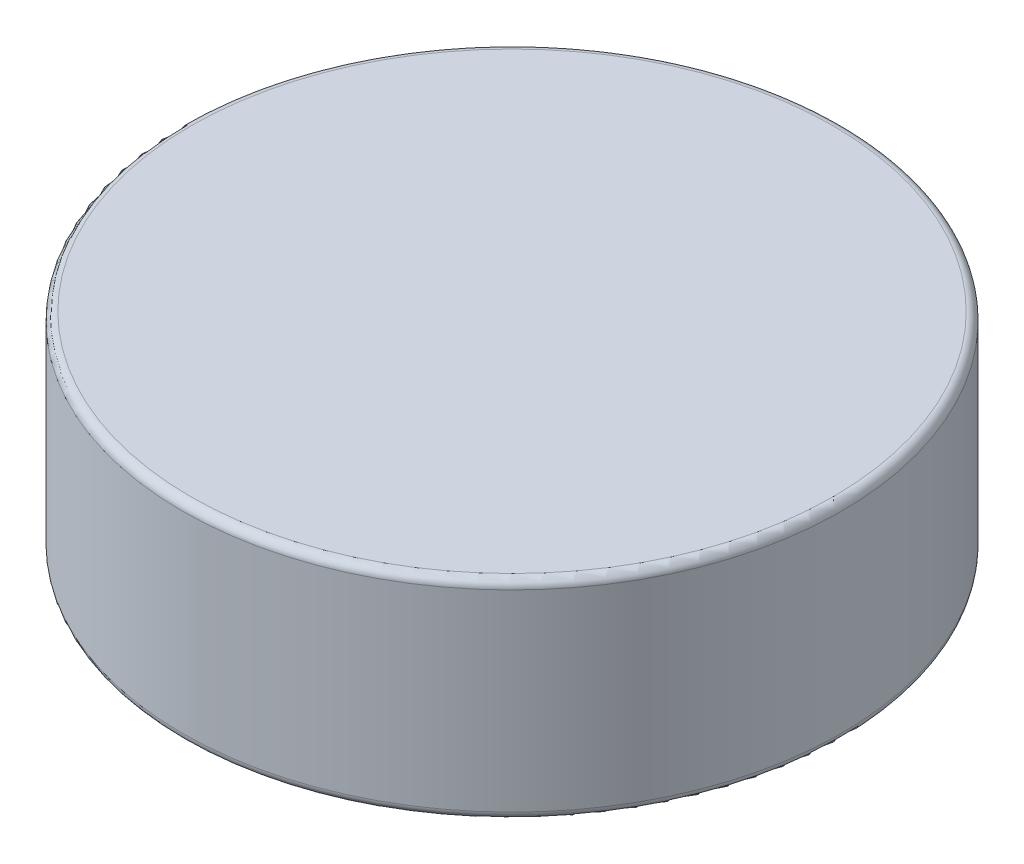
ISO-10303-21;
HEADER;
FILE_DESCRIPTION(('STEP AP214'),'2;1');
FILE_NAME('part.step','',(''),(''),'','','');
FILE_SCHEMA(('AUTOMOTIVE_DESIGN { 1 0 10303 214 1 1 1 1 }'));
ENDSEC;
DATA;
#1=APPLICATION_CONTEXT('core data for automotive mechanical design processes');
#2=APPLICATION_PROTOCOL_DEFINITION('international standard','automotive_design',2000,#1);
#3=PRODUCT_CONTEXT('',#1,'mechanical');
#4=PRODUCT('Part','Part','',(#3));
#5=PRODUCT_RELATED_PRODUCT_CATEGORY('part','',(#4));
#6=PRODUCT_DEFINITION_FORMATION('','',#4);
#7=PRODUCT_DEFINITION_CONTEXT('part definition',#1,'design');
#8=PRODUCT_DEFINITION('design','',#6,#7);
#9=PRODUCT_DEFINITION_SHAPE('','',#8);
#10=(LENGTH_UNIT() NAMED_UNIT(*) SI_UNIT(.MILLI.,.METRE.));
#11=(NAMED_UNIT(*) PLANE_ANGLE_UNIT() SI_UNIT($,.RADIAN.));
#12=(NAMED_UNIT(*) SI_UNIT($,.STERADIAN.) SOLID_ANGLE_UNIT());
#13=UNCERTAINTY_MEASURE_WITH_UNIT(LENGTH_MEASURE(1.E-05),#10,'distance_accuracy_value','');
#14=(GEOMETRIC_REPRESENTATION_CONTEXT(3) GLOBAL_UNCERTAINTY_ASSIGNED_CONTEXT((#13)) GLOBAL_UNIT_ASSIGNED_CONTEXT((#10,
#11,#12)) REPRESENTATION_CONTEXT('',''));
#15=CARTESIAN_POINT('',(0.,0.,0.));
#16=DIRECTION('',(0.,0.,1.));
#17=DIRECTION('',(1.,0.,0.));
#18=AXIS2_PLACEMENT_3D('',#15,#16,#17);
#19=CARTESIAN_POINT('',(0.,3.175,0.));
#20=DIRECTION('',(0.,-1.,0.));
#21=DIRECTION('',(0.,0.,-1.));
#22=AXIS2_PLACEMENT_3D('',#19,#20,#21);
#23=CYLINDRICAL_SURFACE('',#22,5.0038);
#24=CARTESIAN_POINT('',(0.,0.127,0.));
#25=DIRECTION('',(0.,1.,0.));
#26=DIRECTION('',(0.,0.,1.));
#27=AXIS2_PLACEMENT_3D('',#24,#25,#26);
#28=CIRCLE('',#27,5.0038);
#29=CARTESIAN_POINT('',(0.,0.127,5.0038));
#30=VERTEX_POINT('',#29);
#31=EDGE_CURVE('E42',#30,#30,#28,.T.);
#32=ORIENTED_EDGE('',*,*,#31,.T.);
#33=EDGE_LOOP('',(#32));
#34=FACE_BOUND('',#33,.T.);
#35=CARTESIAN_POINT('',(0.,3.048,0.));
#36=DIRECTION('',(0.,1.,0.));
#37=DIRECTION('',(0.,0.,1.));
#38=AXIS2_PLACEMENT_3D('',#35,#36,#37);
#39=CIRCLE('',#38,5.0038);
#40=CARTESIAN_POINT('',(0.,3.048,5.0038));
#41=VERTEX_POINT('',#40);
#42=EDGE_CURVE('E46',#41,#41,#39,.F.);
#43=ORIENTED_EDGE('',*,*,#42,.T.);
#44=EDGE_LOOP('',(#43));
#45=FACE_BOUND('',#44,.T.);
#46=ADVANCED_FACE('F31',(#34,#45),#23,.T.);
#47=CARTESIAN_POINT('',(0.,3.175,0.));
#48=DIRECTION('',(0.,1.,0.));
#49=DIRECTION('',(0.,0.,1.));
#50=AXIS2_PLACEMENT_3D('',#47,#48,#49);
#51=PLANE('',#50);
#52=CARTESIAN_POINT('',(0.,3.175,0.));
#53=DIRECTION('',(0.,1.,0.));
#54=DIRECTION('',(0.,0.,1.));
#55=AXIS2_PLACEMENT_3D('',#52,#53,#54);
#56=CIRCLE('',#55,4.8768);
#57=CARTESIAN_POINT('',(0.,3.175,4.8768));
#58=VERTEX_POINT('',#57);
#59=EDGE_CURVE('E10',#58,#58,#56,.T.);
#60=ORIENTED_EDGE('',*,*,#59,.T.);
#61=EDGE_LOOP('',(#60));
#62=FACE_BOUND('',#61,.T.);
#63=ADVANCED_FACE('F62',(#62),#51,.T.);
#64=CARTESIAN_POINT('',(0.,0.,0.));
#65=DIRECTION('',(0.,1.,0.));
#66=DIRECTION('',(0.,0.,1.));
#67=AXIS2_PLACEMENT_3D('',#64,#65,#66);
#68=PLANE('',#67);
#69=CARTESIAN_POINT('',(0.,0.,0.));
#70=DIRECTION('',(0.,1.,0.));
#71=DIRECTION('',(0.,0.,1.));
#72=AXIS2_PLACEMENT_3D('',#69,#70,#71);
#73=CIRCLE('',#72,4.8768);
#74=CARTESIAN_POINT('',(0.,0.,4.8768));
#75=VERTEX_POINT('',#74);
#76=EDGE_CURVE('E38',#75,#75,#73,.F.);
#77=ORIENTED_EDGE('',*,*,#76,.T.);
#78=EDGE_LOOP('',(#77));
#79=FACE_BOUND('',#78,.T.);
#80=ADVANCED_FACE('F59',(#79),#68,.F.);
#81=CARTESIAN_POINT('',(0.,0.127,0.));
#82=DIRECTION('',(0.,1.,0.));
#83=DIRECTION('',(0.,0.,1.));
#84=AXIS2_PLACEMENT_3D('',#81,#82,#83);
#85=TOROIDAL_SURFACE('',#84,4.8768,0.127);
#86=ORIENTED_EDGE('',*,*,#76,.F.);
#87=EDGE_LOOP('',(#86));
#88=FACE_BOUND('',#87,.T.);
#89=ORIENTED_EDGE('',*,*,#31,.F.);
#90=EDGE_LOOP('',(#89));
#91=FACE_BOUND('',#90,.T.);
#92=ADVANCED_FACE('F55',(#88,#91),#85,.T.);
#93=CARTESIAN_POINT('',(0.,3.048,0.));
#94=DIRECTION('',(0.,1.,0.));
#95=DIRECTION('',(0.,0.,1.));
#96=AXIS2_PLACEMENT_3D('',#93,#94,#95);
#97=TOROIDAL_SURFACE('',#96,4.8768,0.127);
#98=ORIENTED_EDGE('',*,*,#42,.F.);
#99=EDGE_LOOP('',(#98));
#100=FACE_BOUND('',#99,.T.);
#101=ORIENTED_EDGE('',*,*,#59,.F.);
#102=EDGE_LOOP('',(#101));
#103=FACE_BOUND('',#102,.T.);
#104=ADVANCED_FACE('F33',(#100,#103),#97,.T.);
#105=CLOSED_SHELL('',(#46,#63,#80,#92,#104));
#106=MANIFOLD_SOLID_BREP('B2',#105);
#107=ADVANCED_BREP_SHAPE_REPRESENTATION('',(#18,#106),#14);
#108=SHAPE_DEFINITION_REPRESENTATION(#9,#107);
ENDSEC;
END-ISO-10303-21;
